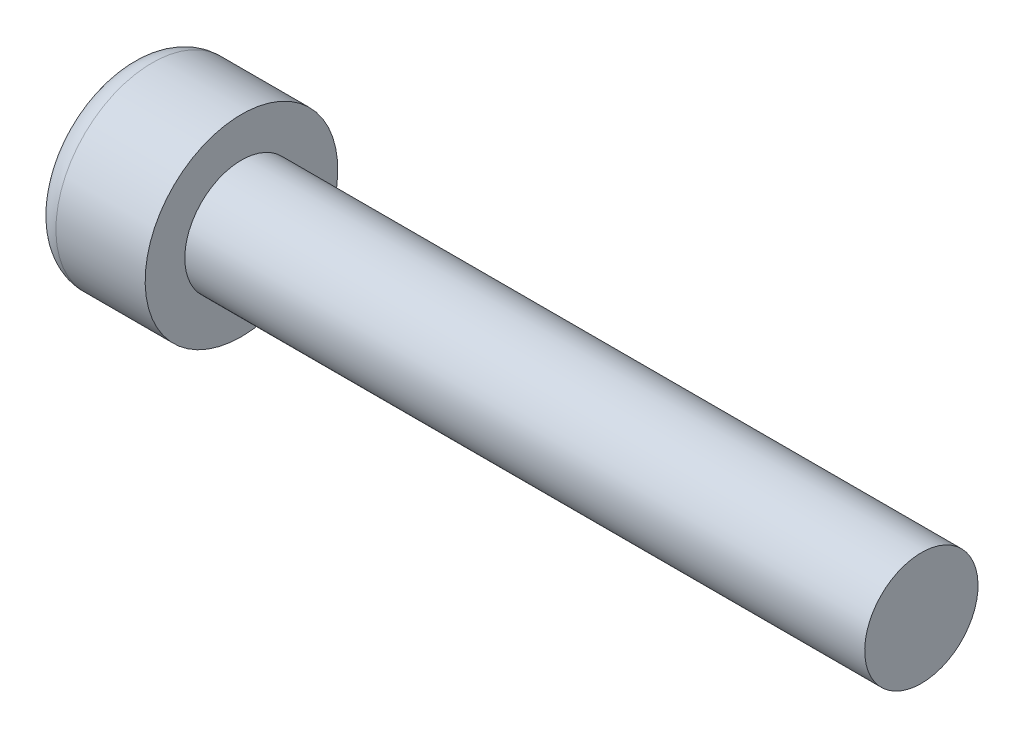
ISO-10303-21;
HEADER;
FILE_DESCRIPTION(('STEP AP214'),'2;1');
FILE_NAME('part.step','',(''),(''),'','','');
FILE_SCHEMA(('AUTOMOTIVE_DESIGN { 1 0 10303 214 1 1 1 1 }'));
ENDSEC;
DATA;
#1=APPLICATION_CONTEXT('core data for automotive mechanical design processes');
#2=APPLICATION_PROTOCOL_DEFINITION('international standard','automotive_design',2000,#1);
#3=PRODUCT_CONTEXT('',#1,'mechanical');
#4=PRODUCT('Part','Part','',(#3));
#5=PRODUCT_RELATED_PRODUCT_CATEGORY('part','',(#4));
#6=PRODUCT_DEFINITION_FORMATION('','',#4);
#7=PRODUCT_DEFINITION_CONTEXT('part definition',#1,'design');
#8=PRODUCT_DEFINITION('design','',#6,#7);
#9=PRODUCT_DEFINITION_SHAPE('','',#8);
#10=(LENGTH_UNIT() NAMED_UNIT(*) SI_UNIT(.MILLI.,.METRE.));
#11=(NAMED_UNIT(*) PLANE_ANGLE_UNIT() SI_UNIT($,.RADIAN.));
#12=(NAMED_UNIT(*) SI_UNIT($,.STERADIAN.) SOLID_ANGLE_UNIT());
#13=UNCERTAINTY_MEASURE_WITH_UNIT(LENGTH_MEASURE(1.E-05),#10,'distance_accuracy_value','');
#14=(GEOMETRIC_REPRESENTATION_CONTEXT(3) GLOBAL_UNCERTAINTY_ASSIGNED_CONTEXT((#13)) GLOBAL_UNIT_ASSIGNED_CONTEXT((#10,
#11,#12)) REPRESENTATION_CONTEXT('',''));
#15=CARTESIAN_POINT('',(0.,0.,0.));
#16=DIRECTION('',(0.,0.,1.));
#17=DIRECTION('',(1.,0.,0.));
#18=AXIS2_PLACEMENT_3D('',#15,#16,#17);
#19=CARTESIAN_POINT('',(0.,0.,0.));
#20=DIRECTION('',(1.,0.,0.));
#21=DIRECTION('',(0.,1.,0.));
#22=AXIS2_PLACEMENT_3D('',#19,#20,#21);
#23=PLANE('',#22);
#24=DIRECTION('',(0.,-0.5,-0.866025403784439));
#25=VECTOR('',#24,1.);
#26=CARTESIAN_POINT('',(0.,2.3094010767585,0.));
#27=LINE('',#26,#25);
#28=CARTESIAN_POINT('',(0.,2.3094010767585,0.));
#29=VERTEX_POINT('',#28);
#30=CARTESIAN_POINT('',(0.,1.15470053837925,-2.));
#31=VERTEX_POINT('',#30);
#32=EDGE_CURVE('E121',#29,#31,#27,.T.);
#33=ORIENTED_EDGE('',*,*,#32,.F.);
#34=DIRECTION('',(0.,0.5,-0.866025403784439));
#35=VECTOR('',#34,1.);
#36=CARTESIAN_POINT('',(0.,1.15470053837925,2.));
#37=LINE('',#36,#35);
#38=CARTESIAN_POINT('',(0.,1.15470053837925,2.));
#39=VERTEX_POINT('',#38);
#40=EDGE_CURVE('E47',#39,#29,#37,.T.);
#41=ORIENTED_EDGE('',*,*,#40,.F.);
#42=DIRECTION('',(0.,1.,0.));
#43=VECTOR('',#42,1.);
#44=CARTESIAN_POINT('',(0.,-1.15470053837925,2.));
#45=LINE('',#44,#43);
#46=CARTESIAN_POINT('',(0.,-1.15470053837925,2.));
#47=VERTEX_POINT('',#46);
#48=EDGE_CURVE('E130',#47,#39,#45,.T.);
#49=ORIENTED_EDGE('',*,*,#48,.F.);
#50=DIRECTION('',(0.,0.5,0.866025403784439));
#51=VECTOR('',#50,1.);
#52=CARTESIAN_POINT('',(0.,-2.3094010767585,0.));
#53=LINE('',#52,#51);
#54=CARTESIAN_POINT('',(0.,-2.3094010767585,0.));
#55=VERTEX_POINT('',#54);
#56=EDGE_CURVE('E128',#55,#47,#53,.T.);
#57=ORIENTED_EDGE('',*,*,#56,.F.);
#58=DIRECTION('',(0.,-0.5,0.866025403784439));
#59=VECTOR('',#58,1.);
#60=CARTESIAN_POINT('',(0.,-1.15470053837925,-2.));
#61=LINE('',#60,#59);
#62=CARTESIAN_POINT('',(0.,-1.15470053837925,-2.));
#63=VERTEX_POINT('',#62);
#64=EDGE_CURVE('E95',#63,#55,#61,.T.);
#65=ORIENTED_EDGE('',*,*,#64,.F.);
#66=DIRECTION('',(0.,-1.,0.));
#67=VECTOR('',#66,1.);
#68=CARTESIAN_POINT('',(0.,1.15470053837925,-2.));
#69=LINE('',#68,#67);
#70=EDGE_CURVE('E124',#31,#63,#69,.T.);
#71=ORIENTED_EDGE('',*,*,#70,.F.);
#72=EDGE_LOOP('',(#33,#41,#49,#57,#65,#71));
#73=FACE_BOUND('',#72,.T.);
#74=CARTESIAN_POINT('',(0.,0.,0.));
#75=DIRECTION('',(-1.,0.,0.));
#76=DIRECTION('',(0.,-1.,0.));
#77=AXIS2_PLACEMENT_3D('',#74,#75,#76);
#78=CIRCLE('',#77,3.1875);
#79=CARTESIAN_POINT('',(0.,-3.1875,0.));
#80=VERTEX_POINT('',#79);
#81=EDGE_CURVE('E11',#80,#80,#78,.T.);
#82=ORIENTED_EDGE('',*,*,#81,.T.);
#83=EDGE_LOOP('',(#82));
#84=FACE_BOUND('',#83,.T.);
#85=ADVANCED_FACE('F33',(#73,#84),#23,.F.);
#86=CARTESIAN_POINT('',(1.0625,0.,0.));
#87=DIRECTION('',(-1.,0.,0.));
#88=DIRECTION('',(0.,-1.,0.));
#89=AXIS2_PLACEMENT_3D('',#86,#87,#88);
#90=TOROIDAL_SURFACE('',#89,3.1875,1.0625);
#91=ORIENTED_EDGE('',*,*,#81,.F.);
#92=EDGE_LOOP('',(#91));
#93=FACE_BOUND('',#92,.T.);
#94=CARTESIAN_POINT('',(1.0625,0.,0.));
#95=DIRECTION('',(-1.,0.,0.));
#96=DIRECTION('',(0.,-1.,0.));
#97=AXIS2_PLACEMENT_3D('',#94,#95,#96);
#98=CIRCLE('',#97,4.25);
#99=CARTESIAN_POINT('',(1.0625,-4.25,0.));
#100=VERTEX_POINT('',#99);
#101=EDGE_CURVE('E40',#100,#100,#98,.T.);
#102=ORIENTED_EDGE('',*,*,#101,.T.);
#103=EDGE_LOOP('',(#102));
#104=FACE_BOUND('',#103,.T.);
#105=ADVANCED_FACE('F150',(#93,#104),#90,.T.);
#106=CARTESIAN_POINT('',(0.,0.,0.));
#107=DIRECTION('',(-1.,0.,0.));
#108=DIRECTION('',(0.,-1.,0.));
#109=AXIS2_PLACEMENT_3D('',#106,#107,#108);
#110=CYLINDRICAL_SURFACE('',#109,4.25);
#111=ORIENTED_EDGE('',*,*,#101,.F.);
#112=EDGE_LOOP('',(#111));
#113=FACE_BOUND('',#112,.T.);
#114=CARTESIAN_POINT('',(5.,0.,0.));
#115=DIRECTION('',(-1.,0.,0.));
#116=DIRECTION('',(0.,-1.,0.));
#117=AXIS2_PLACEMENT_3D('',#114,#115,#116);
#118=CIRCLE('',#117,4.25);
#119=CARTESIAN_POINT('',(5.,-4.25,0.));
#120=VERTEX_POINT('',#119);
#121=EDGE_CURVE('E145',#120,#120,#118,.T.);
#122=ORIENTED_EDGE('',*,*,#121,.T.);
#123=EDGE_LOOP('',(#122));
#124=FACE_BOUND('',#123,.T.);
#125=ADVANCED_FACE('F152',(#113,#124),#110,.T.);
#126=CARTESIAN_POINT('',(5.,4.25,0.));
#127=DIRECTION('',(-1.,0.,0.));
#128=DIRECTION('',(0.,-1.,0.));
#129=AXIS2_PLACEMENT_3D('',#126,#127,#128);
#130=PLANE('',#129);
#131=ORIENTED_EDGE('',*,*,#121,.F.);
#132=EDGE_LOOP('',(#131));
#133=FACE_BOUND('',#132,.T.);
#134=CARTESIAN_POINT('',(5.,0.,0.));
#135=DIRECTION('',(-1.,0.,0.));
#136=DIRECTION('',(0.,-1.,0.));
#137=AXIS2_PLACEMENT_3D('',#134,#135,#136);
#138=CIRCLE('',#137,2.5);
#139=CARTESIAN_POINT('',(5.,-2.5,0.));
#140=VERTEX_POINT('',#139);
#141=EDGE_CURVE('E142',#140,#140,#138,.T.);
#142=ORIENTED_EDGE('',*,*,#141,.T.);
#143=EDGE_LOOP('',(#142));
#144=FACE_BOUND('',#143,.T.);
#145=ADVANCED_FACE('F155',(#133,#144),#130,.F.);
#146=CARTESIAN_POINT('',(0.,0.,0.));
#147=DIRECTION('',(-1.,0.,0.));
#148=DIRECTION('',(0.,-1.,0.));
#149=AXIS2_PLACEMENT_3D('',#146,#147,#148);
#150=CYLINDRICAL_SURFACE('',#149,2.5);
#151=ORIENTED_EDGE('',*,*,#141,.F.);
#152=EDGE_LOOP('',(#151));
#153=FACE_BOUND('',#152,.T.);
#154=CARTESIAN_POINT('',(35.,0.,0.));
#155=DIRECTION('',(-1.,0.,0.));
#156=DIRECTION('',(0.,-1.,0.));
#157=AXIS2_PLACEMENT_3D('',#154,#155,#156);
#158=CIRCLE('',#157,2.49999999999999);
#159=CARTESIAN_POINT('',(35.,-2.49999999999999,0.));
#160=VERTEX_POINT('',#159);
#161=EDGE_CURVE('E134',#160,#160,#158,.T.);
#162=ORIENTED_EDGE('',*,*,#161,.T.);
#163=EDGE_LOOP('',(#162));
#164=FACE_BOUND('',#163,.T.);
#165=ADVANCED_FACE('F161',(#153,#164),#150,.T.);
#166=CARTESIAN_POINT('',(35.,2.5,0.));
#167=DIRECTION('',(-1.,0.,0.));
#168=DIRECTION('',(0.,-1.,0.));
#169=AXIS2_PLACEMENT_3D('',#166,#167,#168);
#170=PLANE('',#169);
#171=ORIENTED_EDGE('',*,*,#161,.F.);
#172=EDGE_LOOP('',(#171));
#173=FACE_BOUND('',#172,.T.);
#174=ADVANCED_FACE('F167',(#173),#170,.F.);
#175=CARTESIAN_POINT('',(2.5,1.15470053837925,2.));
#176=DIRECTION('',(0.,0.866025403784439,0.5));
#177=DIRECTION('',(0.,-0.5,0.866025403784439));
#178=AXIS2_PLACEMENT_3D('',#175,#176,#177);
#179=PLANE('',#178);
#180=ORIENTED_EDGE('',*,*,#40,.T.);
#181=DIRECTION('',(-1.,0.,0.));
#182=VECTOR('',#181,1.);
#183=CARTESIAN_POINT('',(2.5,2.3094010767585,0.));
#184=LINE('',#183,#182);
#185=CARTESIAN_POINT('',(2.5,2.3094010767585,0.));
#186=VERTEX_POINT('',#185);
#187=EDGE_CURVE('E77',#186,#29,#184,.T.);
#188=ORIENTED_EDGE('',*,*,#187,.F.);
#189=DIRECTION('',(0.,0.5,-0.866025403784439));
#190=VECTOR('',#189,1.);
#191=CARTESIAN_POINT('',(2.5,1.15470053837925,2.));
#192=LINE('',#191,#190);
#193=CARTESIAN_POINT('',(2.5,1.15470053837925,2.));
#194=VERTEX_POINT('',#193);
#195=EDGE_CURVE('E132',#194,#186,#192,.T.);
#196=ORIENTED_EDGE('',*,*,#195,.F.);
#197=DIRECTION('',(-1.,0.,0.));
#198=VECTOR('',#197,1.);
#199=CARTESIAN_POINT('',(2.5,1.15470053837925,2.));
#200=LINE('',#199,#198);
#201=EDGE_CURVE('E55',#194,#39,#200,.T.);
#202=ORIENTED_EDGE('',*,*,#201,.T.);
#203=EDGE_LOOP('',(#180,#188,#196,#202));
#204=FACE_BOUND('',#203,.T.);
#205=ADVANCED_FACE('F172',(#204),#179,.F.);
#206=CARTESIAN_POINT('',(2.5,-1.15470053837925,2.));
#207=DIRECTION('',(0.,0.,1.));
#208=DIRECTION('',(1.,0.,0.));
#209=AXIS2_PLACEMENT_3D('',#206,#207,#208);
#210=PLANE('',#209);
#211=ORIENTED_EDGE('',*,*,#48,.T.);
#212=ORIENTED_EDGE('',*,*,#201,.F.);
#213=DIRECTION('',(0.,1.,0.));
#214=VECTOR('',#213,1.);
#215=CARTESIAN_POINT('',(2.5,-1.15470053837925,2.));
#216=LINE('',#215,#214);
#217=CARTESIAN_POINT('',(2.5,-1.15470053837925,2.));
#218=VERTEX_POINT('',#217);
#219=EDGE_CURVE('E107',#218,#194,#216,.T.);
#220=ORIENTED_EDGE('',*,*,#219,.F.);
#221=DIRECTION('',(-1.,0.,0.));
#222=VECTOR('',#221,1.);
#223=CARTESIAN_POINT('',(2.5,-1.15470053837925,2.));
#224=LINE('',#223,#222);
#225=EDGE_CURVE('E99',#218,#47,#224,.T.);
#226=ORIENTED_EDGE('',*,*,#225,.T.);
#227=EDGE_LOOP('',(#211,#212,#220,#226));
#228=FACE_BOUND('',#227,.T.);
#229=ADVANCED_FACE('F177',(#228),#210,.F.);
#230=CARTESIAN_POINT('',(2.5,-2.3094010767585,0.));
#231=DIRECTION('',(0.,-0.866025403784439,0.5));
#232=DIRECTION('',(0.,-0.5,-0.866025403784439));
#233=AXIS2_PLACEMENT_3D('',#230,#231,#232);
#234=PLANE('',#233);
#235=ORIENTED_EDGE('',*,*,#56,.T.);
#236=ORIENTED_EDGE('',*,*,#225,.F.);
#237=DIRECTION('',(0.,0.5,0.866025403784439));
#238=VECTOR('',#237,1.);
#239=CARTESIAN_POINT('',(2.5,-2.3094010767585,0.));
#240=LINE('',#239,#238);
#241=CARTESIAN_POINT('',(2.5,-2.3094010767585,0.));
#242=VERTEX_POINT('',#241);
#243=EDGE_CURVE('E103',#242,#218,#240,.T.);
#244=ORIENTED_EDGE('',*,*,#243,.F.);
#245=DIRECTION('',(-1.,0.,0.));
#246=VECTOR('',#245,1.);
#247=CARTESIAN_POINT('',(2.5,-2.3094010767585,0.));
#248=LINE('',#247,#246);
#249=EDGE_CURVE('E88',#242,#55,#248,.T.);
#250=ORIENTED_EDGE('',*,*,#249,.T.);
#251=EDGE_LOOP('',(#235,#236,#244,#250));
#252=FACE_BOUND('',#251,.T.);
#253=ADVANCED_FACE('F104',(#252),#234,.F.);
#254=CARTESIAN_POINT('',(2.5,-1.15470053837925,-2.));
#255=DIRECTION('',(0.,-0.866025403784438,-0.5));
#256=DIRECTION('',(0.,0.5,-0.866025403784438));
#257=AXIS2_PLACEMENT_3D('',#254,#255,#256);
#258=PLANE('',#257);
#259=ORIENTED_EDGE('',*,*,#64,.T.);
#260=ORIENTED_EDGE('',*,*,#249,.F.);
#261=DIRECTION('',(0.,-0.5,0.866025403784439));
#262=VECTOR('',#261,1.);
#263=CARTESIAN_POINT('',(2.5,-1.15470053837925,-2.));
#264=LINE('',#263,#262);
#265=CARTESIAN_POINT('',(2.5,-1.15470053837925,-2.));
#266=VERTEX_POINT('',#265);
#267=EDGE_CURVE('E92',#266,#242,#264,.T.);
#268=ORIENTED_EDGE('',*,*,#267,.F.);
#269=DIRECTION('',(-1.,0.,0.));
#270=VECTOR('',#269,1.);
#271=CARTESIAN_POINT('',(2.5,-1.15470053837925,-2.));
#272=LINE('',#271,#270);
#273=EDGE_CURVE('E100',#266,#63,#272,.T.);
#274=ORIENTED_EDGE('',*,*,#273,.T.);
#275=EDGE_LOOP('',(#259,#260,#268,#274));
#276=FACE_BOUND('',#275,.T.);
#277=ADVANCED_FACE('F90',(#276),#258,.F.);
#278=CARTESIAN_POINT('',(2.5,1.15470053837925,-2.));
#279=DIRECTION('',(0.,0.,-1.));
#280=DIRECTION('',(-1.,0.,0.));
#281=AXIS2_PLACEMENT_3D('',#278,#279,#280);
#282=PLANE('',#281);
#283=ORIENTED_EDGE('',*,*,#70,.T.);
#284=ORIENTED_EDGE('',*,*,#273,.F.);
#285=DIRECTION('',(0.,-1.,0.));
#286=VECTOR('',#285,1.);
#287=CARTESIAN_POINT('',(2.5,1.15470053837925,-2.));
#288=LINE('',#287,#286);
#289=CARTESIAN_POINT('',(2.5,1.15470053837925,-2.));
#290=VERTEX_POINT('',#289);
#291=EDGE_CURVE('E113',#290,#266,#288,.T.);
#292=ORIENTED_EDGE('',*,*,#291,.F.);
#293=DIRECTION('',(-1.,0.,0.));
#294=VECTOR('',#293,1.);
#295=CARTESIAN_POINT('',(2.5,1.15470053837925,-2.));
#296=LINE('',#295,#294);
#297=EDGE_CURVE('E137',#290,#31,#296,.T.);
#298=ORIENTED_EDGE('',*,*,#297,.T.);
#299=EDGE_LOOP('',(#283,#284,#292,#298));
#300=FACE_BOUND('',#299,.T.);
#301=ADVANCED_FACE('F203',(#300),#282,.F.);
#302=CARTESIAN_POINT('',(2.5,2.3094010767585,0.));
#303=DIRECTION('',(0.,0.866025403784439,-0.5));
#304=DIRECTION('',(0.,0.5,0.866025403784439));
#305=AXIS2_PLACEMENT_3D('',#302,#303,#304);
#306=PLANE('',#305);
#307=ORIENTED_EDGE('',*,*,#32,.T.);
#308=ORIENTED_EDGE('',*,*,#297,.F.);
#309=DIRECTION('',(0.,-0.5,-0.866025403784439));
#310=VECTOR('',#309,1.);
#311=CARTESIAN_POINT('',(2.5,2.3094010767585,0.));
#312=LINE('',#311,#310);
#313=EDGE_CURVE('E115',#186,#290,#312,.T.);
#314=ORIENTED_EDGE('',*,*,#313,.F.);
#315=ORIENTED_EDGE('',*,*,#187,.T.);
#316=EDGE_LOOP('',(#307,#308,#314,#315));
#317=FACE_BOUND('',#316,.T.);
#318=ADVANCED_FACE('F191',(#317),#306,.F.);
#319=CARTESIAN_POINT('',(2.5,0.,0.));
#320=DIRECTION('',(-1.,0.,0.));
#321=DIRECTION('',(0.,-1.,0.));
#322=AXIS2_PLACEMENT_3D('',#319,#320,#321);
#323=PLANE('',#322);
#324=ORIENTED_EDGE('',*,*,#195,.T.);
#325=ORIENTED_EDGE('',*,*,#313,.T.);
#326=ORIENTED_EDGE('',*,*,#291,.T.);
#327=ORIENTED_EDGE('',*,*,#267,.T.);
#328=ORIENTED_EDGE('',*,*,#243,.T.);
#329=ORIENTED_EDGE('',*,*,#219,.T.);
#330=EDGE_LOOP('',(#324,#325,#326,#327,#328,#329));
#331=FACE_BOUND('',#330,.T.);
#332=ADVANCED_FACE('F110',(#331),#323,.T.);
#333=CLOSED_SHELL('',(#85,#105,#125,#145,#165,#174,#205,#229,#253,#277,#301,#318,#332));
#334=MANIFOLD_SOLID_BREP('B2',#333);
#335=ADVANCED_BREP_SHAPE_REPRESENTATION('',(#18,#334),#14);
#336=SHAPE_DEFINITION_REPRESENTATION(#9,#335);
ENDSEC;
END-ISO-10303-21;
